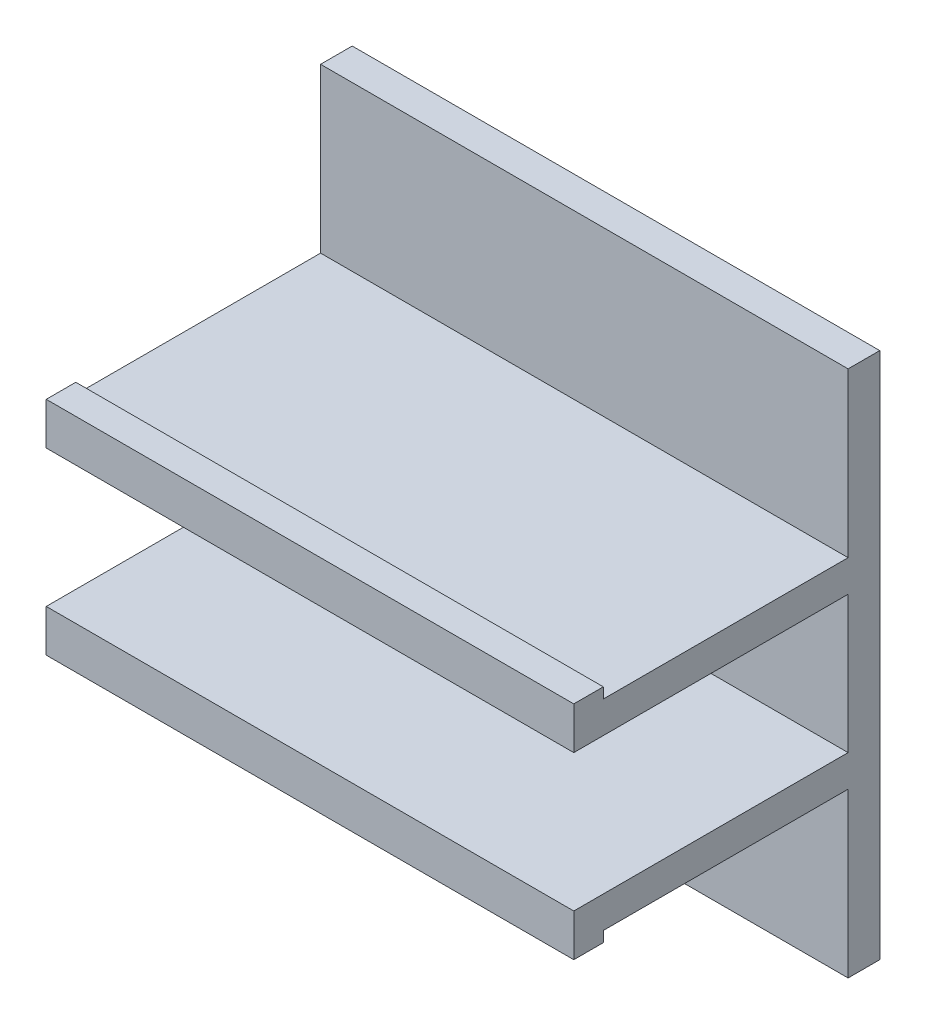
ISO-10303-21;
HEADER;
FILE_DESCRIPTION(('STEP AP214'),'2;1');
FILE_NAME('part.step','',(''),(''),'','','');
FILE_SCHEMA(('AUTOMOTIVE_DESIGN { 1 0 10303 214 1 1 1 1 }'));
ENDSEC;
DATA;
#1=APPLICATION_CONTEXT('core data for automotive mechanical design processes');
#2=APPLICATION_PROTOCOL_DEFINITION('international standard','automotive_design',2000,#1);
#3=PRODUCT_CONTEXT('',#1,'mechanical');
#4=PRODUCT('Part','Part','',(#3));
#5=PRODUCT_RELATED_PRODUCT_CATEGORY('part','',(#4));
#6=PRODUCT_DEFINITION_FORMATION('','',#4);
#7=PRODUCT_DEFINITION_CONTEXT('part definition',#1,'design');
#8=PRODUCT_DEFINITION('design','',#6,#7);
#9=PRODUCT_DEFINITION_SHAPE('','',#8);
#10=(LENGTH_UNIT() NAMED_UNIT(*) SI_UNIT(.MILLI.,.METRE.));
#11=(NAMED_UNIT(*) PLANE_ANGLE_UNIT() SI_UNIT($,.RADIAN.));
#12=(NAMED_UNIT(*) SI_UNIT($,.STERADIAN.) SOLID_ANGLE_UNIT());
#13=UNCERTAINTY_MEASURE_WITH_UNIT(LENGTH_MEASURE(1.E-05),#10,'distance_accuracy_value','');
#14=(GEOMETRIC_REPRESENTATION_CONTEXT(3) GLOBAL_UNCERTAINTY_ASSIGNED_CONTEXT((#13)) GLOBAL_UNIT_ASSIGNED_CONTEXT((#10,
#11,#12)) REPRESENTATION_CONTEXT('',''));
#15=CARTESIAN_POINT('',(0.,0.,0.));
#16=DIRECTION('',(0.,0.,1.));
#17=DIRECTION('',(1.,0.,0.));
#18=AXIS2_PLACEMENT_3D('',#15,#16,#17);
#19=CARTESIAN_POINT('',(0.,0.,14.5));
#20=DIRECTION('',(1.,0.,0.));
#21=DIRECTION('',(0.,1.,0.));
#22=AXIS2_PLACEMENT_3D('',#19,#20,#21);
#23=PLANE('',#22);
#24=DIRECTION('',(0.,-1.,0.));
#25=VECTOR('',#24,1.);
#26=CARTESIAN_POINT('',(0.,7.25,13.1));
#27=LINE('',#26,#25);
#28=CARTESIAN_POINT('',(0.,7.75,13.1));
#29=VERTEX_POINT('',#28);
#30=CARTESIAN_POINT('',(0.,7.25,13.1));
#31=VERTEX_POINT('',#30);
#32=EDGE_CURVE('E152',#29,#31,#27,.T.);
#33=ORIENTED_EDGE('',*,*,#32,.T.);
#34=DIRECTION('',(0.,0.,1.));
#35=VECTOR('',#34,1.);
#36=CARTESIAN_POINT('',(0.,7.25,1.5));
#37=LINE('',#36,#35);
#38=CARTESIAN_POINT('',(0.,7.25,14.5));
#39=VERTEX_POINT('',#38);
#40=EDGE_CURVE('E160',#31,#39,#37,.T.);
#41=ORIENTED_EDGE('',*,*,#40,.T.);
#42=DIRECTION('',(0.,-1.,0.));
#43=VECTOR('',#42,1.);
#44=CARTESIAN_POINT('',(0.,0.,14.5));
#45=LINE('',#44,#43);
#46=CARTESIAN_POINT('',(0.,9.25,14.5));
#47=VERTEX_POINT('',#46);
#48=EDGE_CURVE('E216',#47,#39,#45,.T.);
#49=ORIENTED_EDGE('',*,*,#48,.F.);
#50=DIRECTION('',(0.,0.,1.));
#51=VECTOR('',#50,1.);
#52=CARTESIAN_POINT('',(0.,9.25,1.5));
#53=LINE('',#52,#51);
#54=CARTESIAN_POINT('',(0.,9.25,1.5));
#55=VERTEX_POINT('',#54);
#56=EDGE_CURVE('E57',#55,#47,#53,.T.);
#57=ORIENTED_EDGE('',*,*,#56,.F.);
#58=DIRECTION('',(0.,-1.,0.));
#59=VECTOR('',#58,1.);
#60=CARTESIAN_POINT('',(0.,15.75,1.5));
#61=LINE('',#60,#59);
#62=CARTESIAN_POINT('',(0.,15.75,1.5));
#63=VERTEX_POINT('',#62);
#64=EDGE_CURVE('E177',#63,#55,#61,.T.);
#65=ORIENTED_EDGE('',*,*,#64,.F.);
#66=DIRECTION('',(0.,0.,1.));
#67=VECTOR('',#66,1.);
#68=CARTESIAN_POINT('',(0.,15.75,1.5));
#69=LINE('',#68,#67);
#70=CARTESIAN_POINT('',(0.,15.75,14.5));
#71=VERTEX_POINT('',#70);
#72=EDGE_CURVE('E189',#63,#71,#69,.T.);
#73=ORIENTED_EDGE('',*,*,#72,.T.);
#74=CARTESIAN_POINT('',(0.,17.75,14.5));
#75=VERTEX_POINT('',#74);
#76=EDGE_CURVE('E212',#75,#71,#45,.T.);
#77=ORIENTED_EDGE('',*,*,#76,.F.);
#78=DIRECTION('',(0.,0.,1.));
#79=VECTOR('',#78,1.);
#80=CARTESIAN_POINT('',(0.,17.75,1.5));
#81=LINE('',#80,#79);
#82=CARTESIAN_POINT('',(0.,17.75,13.1));
#83=VERTEX_POINT('',#82);
#84=EDGE_CURVE('E205',#83,#75,#81,.T.);
#85=ORIENTED_EDGE('',*,*,#84,.F.);
#86=DIRECTION('',(0.,-1.,0.));
#87=VECTOR('',#86,1.);
#88=CARTESIAN_POINT('',(0.,17.75,13.1));
#89=LINE('',#88,#87);
#90=CARTESIAN_POINT('',(0.,17.25,13.1));
#91=VERTEX_POINT('',#90);
#92=EDGE_CURVE('E266',#83,#91,#89,.T.);
#93=ORIENTED_EDGE('',*,*,#92,.T.);
#94=DIRECTION('',(0.,0.,-1.));
#95=VECTOR('',#94,1.);
#96=CARTESIAN_POINT('',(0.,17.25,13.1));
#97=LINE('',#96,#95);
#98=CARTESIAN_POINT('',(0.,17.25,1.5));
#99=VERTEX_POINT('',#98);
#100=EDGE_CURVE('E272',#91,#99,#97,.T.);
#101=ORIENTED_EDGE('',*,*,#100,.T.);
#102=DIRECTION('',(0.,-1.,0.));
#103=VECTOR('',#102,1.);
#104=CARTESIAN_POINT('',(0.,25.,1.5));
#105=LINE('',#104,#103);
#106=CARTESIAN_POINT('',(0.,25.,1.5));
#107=VERTEX_POINT('',#106);
#108=EDGE_CURVE('E199',#107,#99,#105,.T.);
#109=ORIENTED_EDGE('',*,*,#108,.F.);
#110=DIRECTION('',(0.,0.,-1.));
#111=VECTOR('',#110,1.);
#112=CARTESIAN_POINT('',(0.,25.,14.5));
#113=LINE('',#112,#111);
#114=CARTESIAN_POINT('',(0.,25.,0.));
#115=VERTEX_POINT('',#114);
#116=EDGE_CURVE('E219',#107,#115,#113,.T.);
#117=ORIENTED_EDGE('',*,*,#116,.T.);
#118=DIRECTION('',(0.,-1.,0.));
#119=VECTOR('',#118,1.);
#120=CARTESIAN_POINT('',(0.,0.,0.));
#121=LINE('',#120,#119);
#122=CARTESIAN_POINT('',(0.,0.,0.));
#123=VERTEX_POINT('',#122);
#124=EDGE_CURVE('E210',#115,#123,#121,.T.);
#125=ORIENTED_EDGE('',*,*,#124,.T.);
#126=DIRECTION('',(0.,0.,-1.));
#127=VECTOR('',#126,1.);
#128=CARTESIAN_POINT('',(0.,0.,14.5));
#129=LINE('',#128,#127);
#130=CARTESIAN_POINT('',(0.,0.,1.5));
#131=VERTEX_POINT('',#130);
#132=EDGE_CURVE('E11',#131,#123,#129,.T.);
#133=ORIENTED_EDGE('',*,*,#132,.F.);
#134=DIRECTION('',(0.,-1.,0.));
#135=VECTOR('',#134,1.);
#136=CARTESIAN_POINT('',(0.,7.25,1.5));
#137=LINE('',#136,#135);
#138=CARTESIAN_POINT('',(0.,7.75,1.5));
#139=VERTEX_POINT('',#138);
#140=EDGE_CURVE('E280',#139,#131,#137,.T.);
#141=ORIENTED_EDGE('',*,*,#140,.F.);
#142=DIRECTION('',(0.,0.,-1.));
#143=VECTOR('',#142,1.);
#144=CARTESIAN_POINT('',(0.,7.75,13.1));
#145=LINE('',#144,#143);
#146=EDGE_CURVE('E162',#29,#139,#145,.T.);
#147=ORIENTED_EDGE('',*,*,#146,.F.);
#148=EDGE_LOOP('',(#33,#41,#49,#57,#65,#73,#77,#85,#93,#101,#109,#117,#125,#133,#141,#147));
#149=FACE_BOUND('',#148,.T.);
#150=ADVANCED_FACE('F35',(#149),#23,.F.);
#151=CARTESIAN_POINT('',(25.,0.,14.5));
#152=DIRECTION('',(-1.,0.,0.));
#153=DIRECTION('',(0.,-1.,0.));
#154=AXIS2_PLACEMENT_3D('',#151,#152,#153);
#155=PLANE('',#154);
#156=DIRECTION('',(0.,1.,0.));
#157=VECTOR('',#156,1.);
#158=CARTESIAN_POINT('',(25.,7.25,13.1));
#159=LINE('',#158,#157);
#160=CARTESIAN_POINT('',(25.,7.25,13.1));
#161=VERTEX_POINT('',#160);
#162=CARTESIAN_POINT('',(25.,7.75,13.1));
#163=VERTEX_POINT('',#162);
#164=EDGE_CURVE('E155',#161,#163,#159,.T.);
#165=ORIENTED_EDGE('',*,*,#164,.T.);
#166=DIRECTION('',(0.,0.,-1.));
#167=VECTOR('',#166,1.);
#168=CARTESIAN_POINT('',(25.,7.75,13.1));
#169=LINE('',#168,#167);
#170=CARTESIAN_POINT('',(25.,7.75,1.5));
#171=VERTEX_POINT('',#170);
#172=EDGE_CURVE('E267',#163,#171,#169,.T.);
#173=ORIENTED_EDGE('',*,*,#172,.T.);
#174=DIRECTION('',(0.,1.,0.));
#175=VECTOR('',#174,1.);
#176=CARTESIAN_POINT('',(25.,7.25,1.5));
#177=LINE('',#176,#175);
#178=CARTESIAN_POINT('',(25.,0.,1.5));
#179=VERTEX_POINT('',#178);
#180=EDGE_CURVE('E172',#179,#171,#177,.T.);
#181=ORIENTED_EDGE('',*,*,#180,.F.);
#182=DIRECTION('',(0.,0.,-1.));
#183=VECTOR('',#182,1.);
#184=CARTESIAN_POINT('',(25.,0.,14.5));
#185=LINE('',#184,#183);
#186=CARTESIAN_POINT('',(25.,0.,0.));
#187=VERTEX_POINT('',#186);
#188=EDGE_CURVE('E42',#179,#187,#185,.T.);
#189=ORIENTED_EDGE('',*,*,#188,.T.);
#190=DIRECTION('',(0.,1.,0.));
#191=VECTOR('',#190,1.);
#192=CARTESIAN_POINT('',(25.,0.,0.));
#193=LINE('',#192,#191);
#194=CARTESIAN_POINT('',(25.,25.,0.));
#195=VERTEX_POINT('',#194);
#196=EDGE_CURVE('E225',#187,#195,#193,.T.);
#197=ORIENTED_EDGE('',*,*,#196,.T.);
#198=DIRECTION('',(0.,0.,-1.));
#199=VECTOR('',#198,1.);
#200=CARTESIAN_POINT('',(25.,25.,14.5));
#201=LINE('',#200,#199);
#202=CARTESIAN_POINT('',(25.,25.,1.5));
#203=VERTEX_POINT('',#202);
#204=EDGE_CURVE('E232',#203,#195,#201,.T.);
#205=ORIENTED_EDGE('',*,*,#204,.F.);
#206=DIRECTION('',(0.,1.,0.));
#207=VECTOR('',#206,1.);
#208=CARTESIAN_POINT('',(25.,25.,1.5));
#209=LINE('',#208,#207);
#210=CARTESIAN_POINT('',(25.,17.25,1.5));
#211=VERTEX_POINT('',#210);
#212=EDGE_CURVE('E201',#211,#203,#209,.T.);
#213=ORIENTED_EDGE('',*,*,#212,.F.);
#214=DIRECTION('',(0.,0.,-1.));
#215=VECTOR('',#214,1.);
#216=CARTESIAN_POINT('',(25.,17.25,13.1));
#217=LINE('',#216,#215);
#218=CARTESIAN_POINT('',(25.,17.25,13.1));
#219=VERTEX_POINT('',#218);
#220=EDGE_CURVE('E257',#219,#211,#217,.T.);
#221=ORIENTED_EDGE('',*,*,#220,.F.);
#222=DIRECTION('',(0.,1.,0.));
#223=VECTOR('',#222,1.);
#224=CARTESIAN_POINT('',(25.,17.75,13.1));
#225=LINE('',#224,#223);
#226=CARTESIAN_POINT('',(25.,17.75,13.1));
#227=VERTEX_POINT('',#226);
#228=EDGE_CURVE('E277',#219,#227,#225,.T.);
#229=ORIENTED_EDGE('',*,*,#228,.T.);
#230=DIRECTION('',(0.,0.,1.));
#231=VECTOR('',#230,1.);
#232=CARTESIAN_POINT('',(25.,17.75,1.5));
#233=LINE('',#232,#231);
#234=CARTESIAN_POINT('',(25.,17.75,14.5));
#235=VERTEX_POINT('',#234);
#236=EDGE_CURVE('E208',#227,#235,#233,.T.);
#237=ORIENTED_EDGE('',*,*,#236,.T.);
#238=DIRECTION('',(0.,1.,0.));
#239=VECTOR('',#238,1.);
#240=CARTESIAN_POINT('',(25.,0.,14.5));
#241=LINE('',#240,#239);
#242=CARTESIAN_POINT('',(25.,15.75,14.5));
#243=VERTEX_POINT('',#242);
#244=EDGE_CURVE('E215',#243,#235,#241,.T.);
#245=ORIENTED_EDGE('',*,*,#244,.F.);
#246=DIRECTION('',(0.,0.,1.));
#247=VECTOR('',#246,1.);
#248=CARTESIAN_POINT('',(25.,15.75,1.5));
#249=LINE('',#248,#247);
#250=CARTESIAN_POINT('',(25.,15.75,1.5));
#251=VERTEX_POINT('',#250);
#252=EDGE_CURVE('E193',#251,#243,#249,.T.);
#253=ORIENTED_EDGE('',*,*,#252,.F.);
#254=DIRECTION('',(0.,1.,0.));
#255=VECTOR('',#254,1.);
#256=CARTESIAN_POINT('',(25.,15.75,1.5));
#257=LINE('',#256,#255);
#258=CARTESIAN_POINT('',(25.,9.25,1.5));
#259=VERTEX_POINT('',#258);
#260=EDGE_CURVE('E183',#259,#251,#257,.T.);
#261=ORIENTED_EDGE('',*,*,#260,.F.);
#262=DIRECTION('',(0.,0.,1.));
#263=VECTOR('',#262,1.);
#264=CARTESIAN_POINT('',(25.,9.25,1.5));
#265=LINE('',#264,#263);
#266=CARTESIAN_POINT('',(25.,9.25,14.5));
#267=VERTEX_POINT('',#266);
#268=EDGE_CURVE('E195',#259,#267,#265,.T.);
#269=ORIENTED_EDGE('',*,*,#268,.T.);
#270=CARTESIAN_POINT('',(25.,7.25,14.5));
#271=VERTEX_POINT('',#270);
#272=EDGE_CURVE('E217',#271,#267,#241,.T.);
#273=ORIENTED_EDGE('',*,*,#272,.F.);
#274=DIRECTION('',(0.,0.,1.));
#275=VECTOR('',#274,1.);
#276=CARTESIAN_POINT('',(25.,7.25,1.5));
#277=LINE('',#276,#275);
#278=EDGE_CURVE('E49',#161,#271,#277,.T.);
#279=ORIENTED_EDGE('',*,*,#278,.F.);
#280=EDGE_LOOP('',(#165,#173,#181,#189,#197,#205,#213,#221,#229,#237,#245,#253,#261,#269,#273,#279));
#281=FACE_BOUND('',#280,.T.);
#282=ADVANCED_FACE('F236',(#281),#155,.F.);
#283=CARTESIAN_POINT('',(0.,7.25,1.5));
#284=DIRECTION('',(0.,1.,0.));
#285=DIRECTION('',(0.,0.,1.));
#286=AXIS2_PLACEMENT_3D('',#283,#284,#285);
#287=PLANE('',#286);
#288=DIRECTION('',(1.,0.,0.));
#289=VECTOR('',#288,1.);
#290=CARTESIAN_POINT('',(0.,7.25,13.1));
#291=LINE('',#290,#289);
#292=EDGE_CURVE('E148',#31,#161,#291,.T.);
#293=ORIENTED_EDGE('',*,*,#292,.T.);
#294=ORIENTED_EDGE('',*,*,#278,.T.);
#295=DIRECTION('',(-1.,0.,0.));
#296=VECTOR('',#295,1.);
#297=CARTESIAN_POINT('',(0.,7.25,14.5));
#298=LINE('',#297,#296);
#299=EDGE_CURVE('E166',#271,#39,#298,.T.);
#300=ORIENTED_EDGE('',*,*,#299,.T.);
#301=ORIENTED_EDGE('',*,*,#40,.F.);
#302=EDGE_LOOP('',(#293,#294,#300,#301));
#303=FACE_BOUND('',#302,.T.);
#304=ADVANCED_FACE('F165',(#303),#287,.F.);
#305=CARTESIAN_POINT('',(0.,0.,14.5));
#306=DIRECTION('',(0.,1.,0.));
#307=DIRECTION('',(0.,0.,1.));
#308=AXIS2_PLACEMENT_3D('',#305,#306,#307);
#309=PLANE('',#308);
#310=DIRECTION('',(1.,0.,0.));
#311=VECTOR('',#310,1.);
#312=CARTESIAN_POINT('',(0.,0.,1.5));
#313=LINE('',#312,#311);
#314=EDGE_CURVE('E282',#131,#179,#313,.T.);
#315=ORIENTED_EDGE('',*,*,#314,.F.);
#316=ORIENTED_EDGE('',*,*,#132,.T.);
#317=DIRECTION('',(1.,0.,0.));
#318=VECTOR('',#317,1.);
#319=CARTESIAN_POINT('',(0.,0.,0.));
#320=LINE('',#319,#318);
#321=EDGE_CURVE('E222',#123,#187,#320,.T.);
#322=ORIENTED_EDGE('',*,*,#321,.T.);
#323=ORIENTED_EDGE('',*,*,#188,.F.);
#324=EDGE_LOOP('',(#315,#316,#322,#323));
#325=FACE_BOUND('',#324,.T.);
#326=ADVANCED_FACE('F244',(#325),#309,.F.);
#327=CARTESIAN_POINT('',(0.,0.,14.5));
#328=DIRECTION('',(0.,0.,-1.));
#329=DIRECTION('',(-1.,0.,0.));
#330=AXIS2_PLACEMENT_3D('',#327,#328,#329);
#331=PLANE('',#330);
#332=ORIENTED_EDGE('',*,*,#76,.T.);
#333=DIRECTION('',(-1.,0.,0.));
#334=VECTOR('',#333,1.);
#335=CARTESIAN_POINT('',(0.,15.75,14.5));
#336=LINE('',#335,#334);
#337=EDGE_CURVE('E170',#243,#71,#336,.T.);
#338=ORIENTED_EDGE('',*,*,#337,.F.);
#339=ORIENTED_EDGE('',*,*,#244,.T.);
#340=DIRECTION('',(1.,0.,0.));
#341=VECTOR('',#340,1.);
#342=CARTESIAN_POINT('',(0.,17.75,14.5));
#343=LINE('',#342,#341);
#344=EDGE_CURVE('E192',#75,#235,#343,.T.);
#345=ORIENTED_EDGE('',*,*,#344,.F.);
#346=EDGE_LOOP('',(#332,#338,#339,#345));
#347=FACE_BOUND('',#346,.T.);
#348=ADVANCED_FACE('F307',(#347),#331,.F.);
#349=CARTESIAN_POINT('',(0.,25.,14.5));
#350=DIRECTION('',(0.,-1.,0.));
#351=DIRECTION('',(0.,0.,-1.));
#352=AXIS2_PLACEMENT_3D('',#349,#350,#351);
#353=PLANE('',#352);
#354=DIRECTION('',(-1.,0.,0.));
#355=VECTOR('',#354,1.);
#356=CARTESIAN_POINT('',(0.,25.,1.5));
#357=LINE('',#356,#355);
#358=EDGE_CURVE('E203',#203,#107,#357,.T.);
#359=ORIENTED_EDGE('',*,*,#358,.F.);
#360=ORIENTED_EDGE('',*,*,#204,.T.);
#361=DIRECTION('',(-1.,0.,0.));
#362=VECTOR('',#361,1.);
#363=CARTESIAN_POINT('',(0.,25.,0.));
#364=LINE('',#363,#362);
#365=EDGE_CURVE('E228',#195,#115,#364,.T.);
#366=ORIENTED_EDGE('',*,*,#365,.T.);
#367=ORIENTED_EDGE('',*,*,#116,.F.);
#368=EDGE_LOOP('',(#359,#360,#366,#367));
#369=FACE_BOUND('',#368,.T.);
#370=ADVANCED_FACE('F252',(#369),#353,.F.);
#371=ORIENTED_EDGE('',*,*,#48,.T.);
#372=ORIENTED_EDGE('',*,*,#299,.F.);
#373=ORIENTED_EDGE('',*,*,#272,.T.);
#374=DIRECTION('',(1.,0.,0.));
#375=VECTOR('',#374,1.);
#376=CARTESIAN_POINT('',(0.,9.25,14.5));
#377=LINE('',#376,#375);
#378=EDGE_CURVE('E168',#47,#267,#377,.T.);
#379=ORIENTED_EDGE('',*,*,#378,.F.);
#380=EDGE_LOOP('',(#371,#372,#373,#379));
#381=FACE_BOUND('',#380,.T.);
#382=ADVANCED_FACE('F320',(#381),#331,.F.);
#383=CARTESIAN_POINT('',(0.,0.,0.));
#384=DIRECTION('',(0.,0.,-1.));
#385=DIRECTION('',(-1.,0.,0.));
#386=AXIS2_PLACEMENT_3D('',#383,#384,#385);
#387=PLANE('',#386);
#388=ORIENTED_EDGE('',*,*,#124,.F.);
#389=ORIENTED_EDGE('',*,*,#365,.F.);
#390=ORIENTED_EDGE('',*,*,#196,.F.);
#391=ORIENTED_EDGE('',*,*,#321,.F.);
#392=EDGE_LOOP('',(#388,#389,#390,#391));
#393=FACE_BOUND('',#392,.T.);
#394=ADVANCED_FACE('F248',(#393),#387,.T.);
#395=CARTESIAN_POINT('',(0.,17.75,1.5));
#396=DIRECTION('',(0.,-1.,0.));
#397=DIRECTION('',(0.,0.,-1.));
#398=AXIS2_PLACEMENT_3D('',#395,#396,#397);
#399=PLANE('',#398);
#400=ORIENTED_EDGE('',*,*,#236,.F.);
#401=DIRECTION('',(-1.,0.,0.));
#402=VECTOR('',#401,1.);
#403=CARTESIAN_POINT('',(0.,17.75,13.1));
#404=LINE('',#403,#402);
#405=EDGE_CURVE('E273',#227,#83,#404,.T.);
#406=ORIENTED_EDGE('',*,*,#405,.T.);
#407=ORIENTED_EDGE('',*,*,#84,.T.);
#408=ORIENTED_EDGE('',*,*,#344,.T.);
#409=EDGE_LOOP('',(#400,#406,#407,#408));
#410=FACE_BOUND('',#409,.T.);
#411=ADVANCED_FACE('F302',(#410),#399,.F.);
#412=CARTESIAN_POINT('',(0.,0.,1.5));
#413=DIRECTION('',(0.,0.,1.));
#414=DIRECTION('',(1.,0.,0.));
#415=AXIS2_PLACEMENT_3D('',#412,#413,#414);
#416=PLANE('',#415);
#417=ORIENTED_EDGE('',*,*,#108,.T.);
#418=DIRECTION('',(1.,0.,0.));
#419=VECTOR('',#418,1.);
#420=CARTESIAN_POINT('',(0.,17.25,1.5));
#421=LINE('',#420,#419);
#422=EDGE_CURVE('E260',#99,#211,#421,.T.);
#423=ORIENTED_EDGE('',*,*,#422,.T.);
#424=ORIENTED_EDGE('',*,*,#212,.T.);
#425=ORIENTED_EDGE('',*,*,#358,.T.);
#426=EDGE_LOOP('',(#417,#423,#424,#425));
#427=FACE_BOUND('',#426,.T.);
#428=ADVANCED_FACE('F261',(#427),#416,.T.);
#429=CARTESIAN_POINT('',(0.,15.75,1.5));
#430=DIRECTION('',(0.,1.,0.));
#431=DIRECTION('',(0.,0.,1.));
#432=AXIS2_PLACEMENT_3D('',#429,#430,#431);
#433=PLANE('',#432);
#434=ORIENTED_EDGE('',*,*,#337,.T.);
#435=ORIENTED_EDGE('',*,*,#72,.F.);
#436=DIRECTION('',(-1.,0.,0.));
#437=VECTOR('',#436,1.);
#438=CARTESIAN_POINT('',(0.,15.75,1.5));
#439=LINE('',#438,#437);
#440=EDGE_CURVE('E185',#251,#63,#439,.T.);
#441=ORIENTED_EDGE('',*,*,#440,.F.);
#442=ORIENTED_EDGE('',*,*,#252,.T.);
#443=EDGE_LOOP('',(#434,#435,#441,#442));
#444=FACE_BOUND('',#443,.T.);
#445=ADVANCED_FACE('F312',(#444),#433,.F.);
#446=CARTESIAN_POINT('',(0.,9.25,1.5));
#447=DIRECTION('',(0.,-1.,0.));
#448=DIRECTION('',(0.,0.,-1.));
#449=AXIS2_PLACEMENT_3D('',#446,#447,#448);
#450=PLANE('',#449);
#451=ORIENTED_EDGE('',*,*,#378,.T.);
#452=ORIENTED_EDGE('',*,*,#268,.F.);
#453=DIRECTION('',(1.,0.,0.));
#454=VECTOR('',#453,1.);
#455=CARTESIAN_POINT('',(0.,9.25,1.5));
#456=LINE('',#455,#454);
#457=EDGE_CURVE('E180',#55,#259,#456,.T.);
#458=ORIENTED_EDGE('',*,*,#457,.F.);
#459=ORIENTED_EDGE('',*,*,#56,.T.);
#460=EDGE_LOOP('',(#451,#452,#458,#459));
#461=FACE_BOUND('',#460,.T.);
#462=ADVANCED_FACE('F318',(#461),#450,.F.);
#463=CARTESIAN_POINT('',(0.,0.,1.5));
#464=DIRECTION('',(0.,0.,1.));
#465=DIRECTION('',(1.,0.,0.));
#466=AXIS2_PLACEMENT_3D('',#463,#464,#465);
#467=PLANE('',#466);
#468=ORIENTED_EDGE('',*,*,#64,.T.);
#469=ORIENTED_EDGE('',*,*,#457,.T.);
#470=ORIENTED_EDGE('',*,*,#260,.T.);
#471=ORIENTED_EDGE('',*,*,#440,.T.);
#472=EDGE_LOOP('',(#468,#469,#470,#471));
#473=FACE_BOUND('',#472,.T.);
#474=ADVANCED_FACE('F315',(#473),#467,.T.);
#475=CARTESIAN_POINT('',(0.,0.,1.5));
#476=DIRECTION('',(0.,0.,1.));
#477=DIRECTION('',(1.,0.,0.));
#478=AXIS2_PLACEMENT_3D('',#475,#476,#477);
#479=PLANE('',#478);
#480=ORIENTED_EDGE('',*,*,#140,.T.);
#481=ORIENTED_EDGE('',*,*,#314,.T.);
#482=ORIENTED_EDGE('',*,*,#180,.T.);
#483=DIRECTION('',(-1.,0.,0.));
#484=VECTOR('',#483,1.);
#485=CARTESIAN_POINT('',(0.,7.75,1.5));
#486=LINE('',#485,#484);
#487=EDGE_CURVE('E163',#171,#139,#486,.T.);
#488=ORIENTED_EDGE('',*,*,#487,.T.);
#489=EDGE_LOOP('',(#480,#481,#482,#488));
#490=FACE_BOUND('',#489,.T.);
#491=ADVANCED_FACE('F286',(#490),#479,.T.);
#492=CARTESIAN_POINT('',(0.,17.25,13.1));
#493=DIRECTION('',(0.,1.,0.));
#494=DIRECTION('',(0.,0.,1.));
#495=AXIS2_PLACEMENT_3D('',#492,#493,#494);
#496=PLANE('',#495);
#497=ORIENTED_EDGE('',*,*,#422,.F.);
#498=ORIENTED_EDGE('',*,*,#100,.F.);
#499=DIRECTION('',(1.,0.,0.));
#500=VECTOR('',#499,1.);
#501=CARTESIAN_POINT('',(0.,17.25,13.1));
#502=LINE('',#501,#500);
#503=EDGE_CURVE('E270',#91,#219,#502,.T.);
#504=ORIENTED_EDGE('',*,*,#503,.T.);
#505=ORIENTED_EDGE('',*,*,#220,.T.);
#506=EDGE_LOOP('',(#497,#498,#504,#505));
#507=FACE_BOUND('',#506,.T.);
#508=ADVANCED_FACE('F269',(#507),#496,.T.);
#509=CARTESIAN_POINT('',(0.,0.,13.1));
#510=DIRECTION('',(0.,0.,1.));
#511=DIRECTION('',(1.,0.,0.));
#512=AXIS2_PLACEMENT_3D('',#509,#510,#511);
#513=PLANE('',#512);
#514=ORIENTED_EDGE('',*,*,#92,.F.);
#515=ORIENTED_EDGE('',*,*,#405,.F.);
#516=ORIENTED_EDGE('',*,*,#228,.F.);
#517=ORIENTED_EDGE('',*,*,#503,.F.);
#518=EDGE_LOOP('',(#514,#515,#516,#517));
#519=FACE_BOUND('',#518,.T.);
#520=ADVANCED_FACE('F429',(#519),#513,.F.);
#521=CARTESIAN_POINT('',(0.,7.75,13.1));
#522=DIRECTION('',(0.,-1.,0.));
#523=DIRECTION('',(0.,0.,-1.));
#524=AXIS2_PLACEMENT_3D('',#521,#522,#523);
#525=PLANE('',#524);
#526=ORIENTED_EDGE('',*,*,#487,.F.);
#527=ORIENTED_EDGE('',*,*,#172,.F.);
#528=DIRECTION('',(-1.,0.,0.));
#529=VECTOR('',#528,1.);
#530=CARTESIAN_POINT('',(0.,7.75,13.1));
#531=LINE('',#530,#529);
#532=EDGE_CURVE('E291',#163,#29,#531,.T.);
#533=ORIENTED_EDGE('',*,*,#532,.T.);
#534=ORIENTED_EDGE('',*,*,#146,.T.);
#535=EDGE_LOOP('',(#526,#527,#533,#534));
#536=FACE_BOUND('',#535,.T.);
#537=ADVANCED_FACE('F288',(#536),#525,.T.);
#538=CARTESIAN_POINT('',(0.,0.,13.1));
#539=DIRECTION('',(0.,0.,-1.));
#540=DIRECTION('',(-1.,0.,0.));
#541=AXIS2_PLACEMENT_3D('',#538,#539,#540);
#542=PLANE('',#541);
#543=ORIENTED_EDGE('',*,*,#32,.F.);
#544=ORIENTED_EDGE('',*,*,#532,.F.);
#545=ORIENTED_EDGE('',*,*,#164,.F.);
#546=ORIENTED_EDGE('',*,*,#292,.F.);
#547=EDGE_LOOP('',(#543,#544,#545,#546));
#548=FACE_BOUND('',#547,.T.);
#549=ADVANCED_FACE('F150',(#548),#542,.T.);
#550=CLOSED_SHELL('',(#150,#282,#304,#326,#348,#370,#382,#394,#411,#428,#445,#462,#474,#491,
#508,#520,#537,#549));
#551=MANIFOLD_SOLID_BREP('B2',#550);
#552=ADVANCED_BREP_SHAPE_REPRESENTATION('',(#18,#551),#14);
#553=SHAPE_DEFINITION_REPRESENTATION(#9,#552);
ENDSEC;
END-ISO-10303-21;
